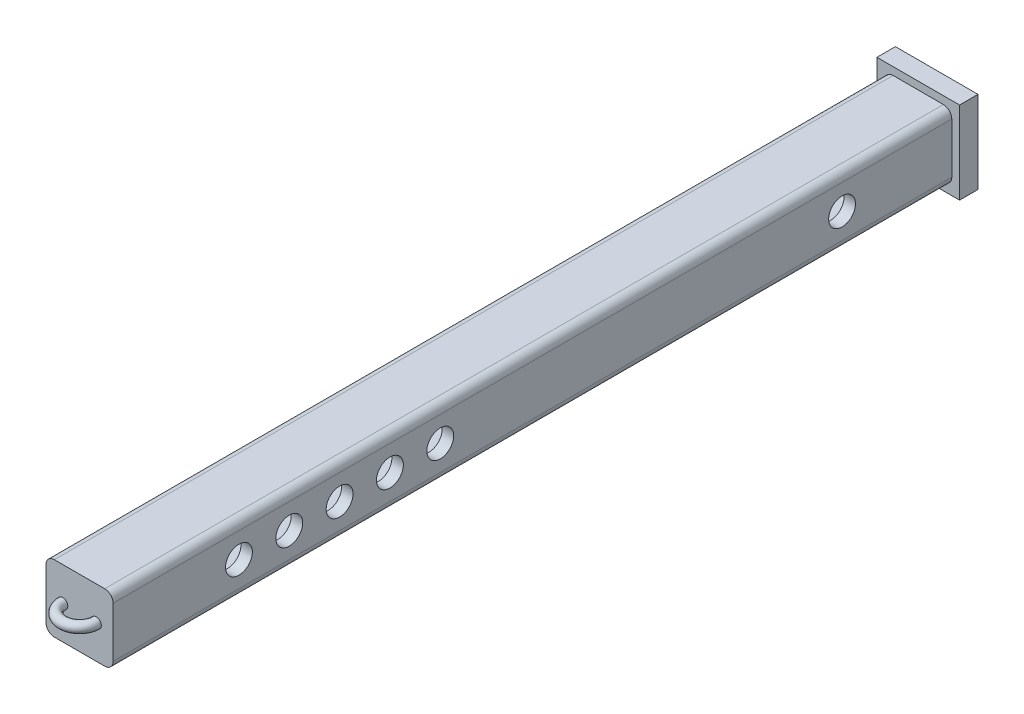
ISO-10303-21;
HEADER;
FILE_DESCRIPTION(('STEP AP214'),'2;1');
FILE_NAME('part.step','',(''),(''),'','','');
FILE_SCHEMA(('AUTOMOTIVE_DESIGN { 1 0 10303 214 1 1 1 1 }'));
ENDSEC;
DATA;
#1=APPLICATION_CONTEXT('core data for automotive mechanical design processes');
#2=APPLICATION_PROTOCOL_DEFINITION('international standard','automotive_design',2000,#1);
#3=PRODUCT_CONTEXT('',#1,'mechanical');
#4=PRODUCT('Part','Part','',(#3));
#5=PRODUCT_RELATED_PRODUCT_CATEGORY('part','',(#4));
#6=PRODUCT_DEFINITION_FORMATION('','',#4);
#7=PRODUCT_DEFINITION_CONTEXT('part definition',#1,'design');
#8=PRODUCT_DEFINITION('design','',#6,#7);
#9=PRODUCT_DEFINITION_SHAPE('','',#8);
#10=(LENGTH_UNIT() NAMED_UNIT(*) SI_UNIT(.MILLI.,.METRE.));
#11=(NAMED_UNIT(*) PLANE_ANGLE_UNIT() SI_UNIT($,.RADIAN.));
#12=(NAMED_UNIT(*) SI_UNIT($,.STERADIAN.) SOLID_ANGLE_UNIT());
#13=UNCERTAINTY_MEASURE_WITH_UNIT(LENGTH_MEASURE(1.E-05),#10,'distance_accuracy_value','');
#14=(GEOMETRIC_REPRESENTATION_CONTEXT(3) GLOBAL_UNCERTAINTY_ASSIGNED_CONTEXT((#13)) GLOBAL_UNIT_ASSIGNED_CONTEXT((#10,
#11,#12)) REPRESENTATION_CONTEXT('',''));
#15=CARTESIAN_POINT('',(0.,0.,0.));
#16=DIRECTION('',(0.,0.,1.));
#17=DIRECTION('',(1.,0.,0.));
#18=AXIS2_PLACEMENT_3D('',#15,#16,#17);
#19=CARTESIAN_POINT('',(20.,-20.,500.));
#20=DIRECTION('',(-1.,0.,0.));
#21=DIRECTION('',(0.,0.,1.));
#22=AXIS2_PLACEMENT_3D('',#19,#20,#21);
#23=PLANE('',#22);
#24=CARTESIAN_POINT('',(20.,0.,65.3991939216552));
#25=DIRECTION('',(1.,0.,0.));
#26=DIRECTION('',(0.,0.,-1.));
#27=AXIS2_PLACEMENT_3D('',#24,#25,#26);
#28=CIRCLE('',#27,8.00000000000001);
#29=CARTESIAN_POINT('',(20.,0.,57.3991939216551));
#30=VERTEX_POINT('',#29);
#31=EDGE_CURVE('E278',#30,#30,#28,.T.);
#32=ORIENTED_EDGE('',*,*,#31,.F.);
#33=EDGE_LOOP('',(#32));
#34=FACE_BOUND('',#33,.T.);
#35=CARTESIAN_POINT('',(20.,-2.09705720765085E-13,334.968679319196));
#36=DIRECTION('',(1.,0.,0.));
#37=DIRECTION('',(0.,0.,-1.));
#38=AXIS2_PLACEMENT_3D('',#35,#36,#37);
#39=CIRCLE('',#38,7.99999999999998);
#40=CARTESIAN_POINT('',(20.,-2.09705720765085E-13,326.968679319196));
#41=VERTEX_POINT('',#40);
#42=EDGE_CURVE('E730',#41,#41,#39,.T.);
#43=ORIENTED_EDGE('',*,*,#42,.F.);
#44=EDGE_LOOP('',(#43));
#45=FACE_BOUND('',#44,.T.);
#46=CARTESIAN_POINT('',(20.,0.,304.968679319196));
#47=DIRECTION('',(1.,0.,0.));
#48=DIRECTION('',(0.,0.,-1.));
#49=AXIS2_PLACEMENT_3D('',#46,#47,#48);
#50=CIRCLE('',#49,7.99999999999998);
#51=CARTESIAN_POINT('',(20.,0.,296.968679319196));
#52=VERTEX_POINT('',#51);
#53=EDGE_CURVE('E727',#52,#52,#50,.T.);
#54=ORIENTED_EDGE('',*,*,#53,.F.);
#55=EDGE_LOOP('',(#54));
#56=FACE_BOUND('',#55,.T.);
#57=CARTESIAN_POINT('',(20.,-4.19194601095673E-13,364.968679319196));
#58=DIRECTION('',(1.,0.,0.));
#59=DIRECTION('',(0.,0.,-1.));
#60=AXIS2_PLACEMENT_3D('',#57,#58,#59);
#61=CIRCLE('',#60,7.99999999999998);
#62=CARTESIAN_POINT('',(20.,-4.19194601095673E-13,356.968679319196));
#63=VERTEX_POINT('',#62);
#64=EDGE_CURVE('E723',#63,#63,#61,.T.);
#65=ORIENTED_EDGE('',*,*,#64,.F.);
#66=EDGE_LOOP('',(#65));
#67=FACE_BOUND('',#66,.T.);
#68=CARTESIAN_POINT('',(20.,-6.28683481426261E-13,394.968679319196));
#69=DIRECTION('',(1.,0.,0.));
#70=DIRECTION('',(0.,0.,-1.));
#71=AXIS2_PLACEMENT_3D('',#68,#69,#70);
#72=CIRCLE('',#71,7.99999999999998);
#73=CARTESIAN_POINT('',(20.,-6.28683481426261E-13,386.968679319196));
#74=VERTEX_POINT('',#73);
#75=EDGE_CURVE('E721',#74,#74,#72,.T.);
#76=ORIENTED_EDGE('',*,*,#75,.F.);
#77=EDGE_LOOP('',(#76));
#78=FACE_BOUND('',#77,.T.);
#79=CARTESIAN_POINT('',(20.,-8.38172361756849E-13,424.968679319196));
#80=DIRECTION('',(1.,0.,0.));
#81=DIRECTION('',(0.,0.,-1.));
#82=AXIS2_PLACEMENT_3D('',#79,#80,#81);
#83=CIRCLE('',#82,7.99999999999998);
#84=CARTESIAN_POINT('',(20.,-8.38172361756849E-13,416.968679319196));
#85=VERTEX_POINT('',#84);
#86=EDGE_CURVE('E717',#85,#85,#83,.T.);
#87=ORIENTED_EDGE('',*,*,#86,.F.);
#88=EDGE_LOOP('',(#87));
#89=FACE_BOUND('',#88,.T.);
#90=DIRECTION('',(0.,1.,0.));
#91=VECTOR('',#90,1.);
#92=CARTESIAN_POINT('',(20.,-20.,500.));
#93=LINE('',#92,#91);
#94=CARTESIAN_POINT('',(20.,-15.,500.));
#95=VERTEX_POINT('',#94);
#96=CARTESIAN_POINT('',(20.,15.,500.));
#97=VERTEX_POINT('',#96);
#98=EDGE_CURVE('E215',#95,#97,#93,.T.);
#99=ORIENTED_EDGE('',*,*,#98,.F.);
#100=DIRECTION('',(0.,0.,-1.));
#101=VECTOR('',#100,1.);
#102=CARTESIAN_POINT('',(20.,-15.,500.));
#103=LINE('',#102,#101);
#104=CARTESIAN_POINT('',(20.,-15.,0.));
#105=VERTEX_POINT('',#104);
#106=EDGE_CURVE('E241',#95,#105,#103,.T.);
#107=ORIENTED_EDGE('',*,*,#106,.T.);
#108=DIRECTION('',(0.,1.,0.));
#109=VECTOR('',#108,1.);
#110=CARTESIAN_POINT('',(20.,-20.,0.));
#111=LINE('',#110,#109);
#112=CARTESIAN_POINT('',(20.,15.,0.));
#113=VERTEX_POINT('',#112);
#114=EDGE_CURVE('E227',#105,#113,#111,.T.);
#115=ORIENTED_EDGE('',*,*,#114,.T.);
#116=DIRECTION('',(0.,0.,-1.));
#117=VECTOR('',#116,1.);
#118=CARTESIAN_POINT('',(20.,15.,500.));
#119=LINE('',#118,#117);
#120=EDGE_CURVE('E226',#113,#97,#119,.F.);
#121=ORIENTED_EDGE('',*,*,#120,.T.);
#122=EDGE_LOOP('',(#99,#107,#115,#121));
#123=FACE_BOUND('',#122,.T.);
#124=ADVANCED_FACE('F33',(#34,#45,#56,#67,#78,#89,#123),#23,.F.);
#125=CARTESIAN_POINT('',(-20.,20.,500.));
#126=DIRECTION('',(0.,-1.,0.));
#127=DIRECTION('',(0.,0.,-1.));
#128=AXIS2_PLACEMENT_3D('',#125,#126,#127);
#129=PLANE('',#128);
#130=DIRECTION('',(-1.,0.,0.));
#131=VECTOR('',#130,1.);
#132=CARTESIAN_POINT('',(-20.,20.,0.));
#133=LINE('',#132,#131);
#134=CARTESIAN_POINT('',(15.,20.,0.));
#135=VERTEX_POINT('',#134);
#136=CARTESIAN_POINT('',(-15.,20.,0.));
#137=VERTEX_POINT('',#136);
#138=EDGE_CURVE('E230',#135,#137,#133,.T.);
#139=ORIENTED_EDGE('',*,*,#138,.T.);
#140=DIRECTION('',(0.,0.,-1.));
#141=VECTOR('',#140,1.);
#142=CARTESIAN_POINT('',(-15.,20.,500.));
#143=LINE('',#142,#141);
#144=CARTESIAN_POINT('',(-15.,20.,500.));
#145=VERTEX_POINT('',#144);
#146=EDGE_CURVE('E11',#137,#145,#143,.F.);
#147=ORIENTED_EDGE('',*,*,#146,.T.);
#148=DIRECTION('',(-1.,0.,0.));
#149=VECTOR('',#148,1.);
#150=CARTESIAN_POINT('',(-20.,20.,500.));
#151=LINE('',#150,#149);
#152=CARTESIAN_POINT('',(15.,20.,500.));
#153=VERTEX_POINT('',#152);
#154=EDGE_CURVE('E218',#153,#145,#151,.T.);
#155=ORIENTED_EDGE('',*,*,#154,.F.);
#156=DIRECTION('',(0.,0.,-1.));
#157=VECTOR('',#156,1.);
#158=CARTESIAN_POINT('',(15.,20.,500.));
#159=LINE('',#158,#157);
#160=EDGE_CURVE('E42',#153,#135,#159,.T.);
#161=ORIENTED_EDGE('',*,*,#160,.T.);
#162=EDGE_LOOP('',(#139,#147,#155,#161));
#163=FACE_BOUND('',#162,.T.);
#164=ADVANCED_FACE('F347',(#163),#129,.F.);
#165=CARTESIAN_POINT('',(-20.,-20.,500.));
#166=DIRECTION('',(1.,0.,0.));
#167=DIRECTION('',(0.,0.,-1.));
#168=AXIS2_PLACEMENT_3D('',#165,#166,#167);
#169=PLANE('',#168);
#170=CARTESIAN_POINT('',(-20.,0.,65.3991939216552));
#171=DIRECTION('',(1.,0.,0.));
#172=DIRECTION('',(0.,0.,-1.));
#173=AXIS2_PLACEMENT_3D('',#170,#171,#172);
#174=CIRCLE('',#173,8.00000000000001);
#175=CARTESIAN_POINT('',(-20.,0.,57.3991939216551));
#176=VERTEX_POINT('',#175);
#177=EDGE_CURVE('E315',#176,#176,#174,.T.);
#178=ORIENTED_EDGE('',*,*,#177,.T.);
#179=EDGE_LOOP('',(#178));
#180=FACE_BOUND('',#179,.T.);
#181=CARTESIAN_POINT('',(-20.,-2.09705720765085E-13,334.968679319196));
#182=DIRECTION('',(1.,0.,0.));
#183=DIRECTION('',(0.,0.,-1.));
#184=AXIS2_PLACEMENT_3D('',#181,#182,#183);
#185=CIRCLE('',#184,7.99999999999998);
#186=CARTESIAN_POINT('',(-20.,-2.09705720765085E-13,326.968679319196));
#187=VERTEX_POINT('',#186);
#188=EDGE_CURVE('E300',#187,#187,#185,.T.);
#189=ORIENTED_EDGE('',*,*,#188,.T.);
#190=EDGE_LOOP('',(#189));
#191=FACE_BOUND('',#190,.T.);
#192=CARTESIAN_POINT('',(-20.,0.,304.968679319196));
#193=DIRECTION('',(1.,0.,0.));
#194=DIRECTION('',(0.,0.,-1.));
#195=AXIS2_PLACEMENT_3D('',#192,#193,#194);
#196=CIRCLE('',#195,7.99999999999998);
#197=CARTESIAN_POINT('',(-20.,0.,296.968679319196));
#198=VERTEX_POINT('',#197);
#199=EDGE_CURVE('E296',#198,#198,#196,.T.);
#200=ORIENTED_EDGE('',*,*,#199,.T.);
#201=EDGE_LOOP('',(#200));
#202=FACE_BOUND('',#201,.T.);
#203=CARTESIAN_POINT('',(-20.,-4.19194601095673E-13,364.968679319196));
#204=DIRECTION('',(1.,0.,0.));
#205=DIRECTION('',(0.,0.,-1.));
#206=AXIS2_PLACEMENT_3D('',#203,#204,#205);
#207=CIRCLE('',#206,7.99999999999998);
#208=CARTESIAN_POINT('',(-20.,-4.19194601095673E-13,356.968679319196));
#209=VERTEX_POINT('',#208);
#210=EDGE_CURVE('E292',#209,#209,#207,.T.);
#211=ORIENTED_EDGE('',*,*,#210,.T.);
#212=EDGE_LOOP('',(#211));
#213=FACE_BOUND('',#212,.T.);
#214=CARTESIAN_POINT('',(-20.,-6.28683481426261E-13,394.968679319196));
#215=DIRECTION('',(1.,0.,0.));
#216=DIRECTION('',(0.,0.,-1.));
#217=AXIS2_PLACEMENT_3D('',#214,#215,#216);
#218=CIRCLE('',#217,7.99999999999998);
#219=CARTESIAN_POINT('',(-20.,-6.28683481426261E-13,386.968679319196));
#220=VERTEX_POINT('',#219);
#221=EDGE_CURVE('E288',#220,#220,#218,.T.);
#222=ORIENTED_EDGE('',*,*,#221,.T.);
#223=EDGE_LOOP('',(#222));
#224=FACE_BOUND('',#223,.T.);
#225=CARTESIAN_POINT('',(-20.,-8.38172361756849E-13,424.968679319196));
#226=DIRECTION('',(1.,0.,0.));
#227=DIRECTION('',(0.,0.,-1.));
#228=AXIS2_PLACEMENT_3D('',#225,#226,#227);
#229=CIRCLE('',#228,7.99999999999998);
#230=CARTESIAN_POINT('',(-20.,-8.38172361756849E-13,416.968679319196));
#231=VERTEX_POINT('',#230);
#232=EDGE_CURVE('E283',#231,#231,#229,.T.);
#233=ORIENTED_EDGE('',*,*,#232,.T.);
#234=EDGE_LOOP('',(#233));
#235=FACE_BOUND('',#234,.T.);
#236=DIRECTION('',(0.,-1.,0.));
#237=VECTOR('',#236,1.);
#238=CARTESIAN_POINT('',(-20.,-20.,0.));
#239=LINE('',#238,#237);
#240=CARTESIAN_POINT('',(-20.,15.,0.));
#241=VERTEX_POINT('',#240);
#242=CARTESIAN_POINT('',(-20.,-15.,0.));
#243=VERTEX_POINT('',#242);
#244=EDGE_CURVE('E233',#241,#243,#239,.T.);
#245=ORIENTED_EDGE('',*,*,#244,.T.);
#246=DIRECTION('',(0.,0.,-1.));
#247=VECTOR('',#246,1.);
#248=CARTESIAN_POINT('',(-20.,-15.,500.));
#249=LINE('',#248,#247);
#250=CARTESIAN_POINT('',(-20.,-15.,500.));
#251=VERTEX_POINT('',#250);
#252=EDGE_CURVE('E50',#243,#251,#249,.F.);
#253=ORIENTED_EDGE('',*,*,#252,.T.);
#254=DIRECTION('',(0.,-1.,0.));
#255=VECTOR('',#254,1.);
#256=CARTESIAN_POINT('',(-20.,-20.,500.));
#257=LINE('',#256,#255);
#258=CARTESIAN_POINT('',(-20.,15.,500.));
#259=VERTEX_POINT('',#258);
#260=EDGE_CURVE('E221',#259,#251,#257,.T.);
#261=ORIENTED_EDGE('',*,*,#260,.F.);
#262=DIRECTION('',(0.,0.,-1.));
#263=VECTOR('',#262,1.);
#264=CARTESIAN_POINT('',(-20.,15.,500.));
#265=LINE('',#264,#263);
#266=EDGE_CURVE('E268',#259,#241,#265,.T.);
#267=ORIENTED_EDGE('',*,*,#266,.T.);
#268=EDGE_LOOP('',(#245,#253,#261,#267));
#269=FACE_BOUND('',#268,.T.);
#270=ADVANCED_FACE('F353',(#180,#191,#202,#213,#224,#235,#269),#169,.F.);
#271=CARTESIAN_POINT('',(-20.,-20.,500.));
#272=DIRECTION('',(0.,1.,0.));
#273=DIRECTION('',(0.,0.,1.));
#274=AXIS2_PLACEMENT_3D('',#271,#272,#273);
#275=PLANE('',#274);
#276=DIRECTION('',(1.,0.,0.));
#277=VECTOR('',#276,1.);
#278=CARTESIAN_POINT('',(-20.,-20.,0.));
#279=LINE('',#278,#277);
#280=CARTESIAN_POINT('',(-15.,-20.,0.));
#281=VERTEX_POINT('',#280);
#282=CARTESIAN_POINT('',(15.,-20.,0.));
#283=VERTEX_POINT('',#282);
#284=EDGE_CURVE('E219',#281,#283,#279,.T.);
#285=ORIENTED_EDGE('',*,*,#284,.T.);
#286=DIRECTION('',(0.,0.,-1.));
#287=VECTOR('',#286,1.);
#288=CARTESIAN_POINT('',(15.,-20.,500.));
#289=LINE('',#288,#287);
#290=CARTESIAN_POINT('',(15.,-20.,500.));
#291=VERTEX_POINT('',#290);
#292=EDGE_CURVE('E259',#283,#291,#289,.F.);
#293=ORIENTED_EDGE('',*,*,#292,.T.);
#294=DIRECTION('',(1.,0.,0.));
#295=VECTOR('',#294,1.);
#296=CARTESIAN_POINT('',(-20.,-20.,500.));
#297=LINE('',#296,#295);
#298=CARTESIAN_POINT('',(-15.,-20.,500.));
#299=VERTEX_POINT('',#298);
#300=EDGE_CURVE('E223',#299,#291,#297,.T.);
#301=ORIENTED_EDGE('',*,*,#300,.F.);
#302=DIRECTION('',(0.,0.,-1.));
#303=VECTOR('',#302,1.);
#304=CARTESIAN_POINT('',(-15.,-20.,500.));
#305=LINE('',#304,#303);
#306=EDGE_CURVE('E256',#299,#281,#305,.T.);
#307=ORIENTED_EDGE('',*,*,#306,.T.);
#308=EDGE_LOOP('',(#285,#293,#301,#307));
#309=FACE_BOUND('',#308,.T.);
#310=ADVANCED_FACE('F385',(#309),#275,.F.);
#311=CARTESIAN_POINT('',(0.,0.,500.));
#312=DIRECTION('',(0.,0.,-1.));
#313=DIRECTION('',(-1.,0.,0.));
#314=AXIS2_PLACEMENT_3D('',#311,#312,#313);
#315=PLANE('',#314);
#316=CARTESIAN_POINT('',(-10.,0.,500.));
#317=DIRECTION('',(0.,0.,-1.));
#318=DIRECTION('',(-1.,0.,0.));
#319=AXIS2_PLACEMENT_3D('',#316,#317,#318);
#320=CIRCLE('',#319,3.);
#321=CARTESIAN_POINT('',(-13.,0.,500.));
#322=VERTEX_POINT('',#321);
#323=EDGE_CURVE('E231',#322,#322,#320,.T.);
#324=ORIENTED_EDGE('',*,*,#323,.T.);
#325=EDGE_LOOP('',(#324));
#326=FACE_BOUND('',#325,.T.);
#327=CARTESIAN_POINT('',(10.,0.,500.));
#328=DIRECTION('',(0.,0.,-1.));
#329=DIRECTION('',(-1.,0.,0.));
#330=AXIS2_PLACEMENT_3D('',#327,#328,#329);
#331=CIRCLE('',#330,3.);
#332=CARTESIAN_POINT('',(13.,0.,500.));
#333=VERTEX_POINT('',#332);
#334=EDGE_CURVE('E206',#333,#333,#331,.T.);
#335=ORIENTED_EDGE('',*,*,#334,.T.);
#336=EDGE_LOOP('',(#335));
#337=FACE_BOUND('',#336,.T.);
#338=ORIENTED_EDGE('',*,*,#300,.T.);
#339=CARTESIAN_POINT('',(15.,-15.,500.));
#340=DIRECTION('',(0.,0.,-1.));
#341=DIRECTION('',(-1.,0.,0.));
#342=AXIS2_PLACEMENT_3D('',#339,#340,#341);
#343=CIRCLE('',#342,5.);
#344=EDGE_CURVE('E266',#291,#95,#343,.F.);
#345=ORIENTED_EDGE('',*,*,#344,.T.);
#346=ORIENTED_EDGE('',*,*,#98,.T.);
#347=CARTESIAN_POINT('',(15.,15.,500.));
#348=DIRECTION('',(0.,0.,-1.));
#349=DIRECTION('',(-1.,0.,0.));
#350=AXIS2_PLACEMENT_3D('',#347,#348,#349);
#351=CIRCLE('',#350,5.);
#352=EDGE_CURVE('E261',#97,#153,#351,.F.);
#353=ORIENTED_EDGE('',*,*,#352,.T.);
#354=ORIENTED_EDGE('',*,*,#154,.T.);
#355=CARTESIAN_POINT('',(-15.,15.,500.));
#356=DIRECTION('',(0.,0.,-1.));
#357=DIRECTION('',(-1.,0.,0.));
#358=AXIS2_PLACEMENT_3D('',#355,#356,#357);
#359=CIRCLE('',#358,5.);
#360=EDGE_CURVE('E57',#145,#259,#359,.F.);
#361=ORIENTED_EDGE('',*,*,#360,.T.);
#362=ORIENTED_EDGE('',*,*,#260,.T.);
#363=CARTESIAN_POINT('',(-15.,-15.,500.));
#364=DIRECTION('',(0.,0.,-1.));
#365=DIRECTION('',(-1.,0.,0.));
#366=AXIS2_PLACEMENT_3D('',#363,#364,#365);
#367=CIRCLE('',#366,5.);
#368=EDGE_CURVE('E264',#251,#299,#367,.F.);
#369=ORIENTED_EDGE('',*,*,#368,.T.);
#370=EDGE_LOOP('',(#338,#345,#346,#353,#354,#361,#362,#369));
#371=FACE_BOUND('',#370,.T.);
#372=ADVANCED_FACE('F388',(#326,#337,#371),#315,.F.);
#373=CARTESIAN_POINT('',(0.,0.,500.));
#374=DIRECTION('',(0.,1.,0.));
#375=DIRECTION('',(0.,0.,1.));
#376=AXIS2_PLACEMENT_3D('',#373,#374,#375);
#377=TOROIDAL_SURFACE('',#376,10.,3.);
#378=CARTESIAN_POINT('',(0.,0.,500.));
#379=DIRECTION('',(0.,1.,0.));
#380=DIRECTION('',(0.,0.,1.));
#381=AXIS2_PLACEMENT_3D('',#378,#379,#380);
#382=CIRCLE('',#381,13.);
#383=EDGE_CURVE('',#322,#333,#382,.T.);
#384=ORIENTED_EDGE('',*,*,#323,.F.);
#385=ORIENTED_EDGE('',*,*,#334,.F.);
#386=ORIENTED_EDGE('',*,*,#383,.T.);
#387=ORIENTED_EDGE('',*,*,#383,.F.);
#388=EDGE_LOOP('',(#384,#386,#385,#387));
#389=FACE_BOUND('',#388,.T.);
#390=ADVANCED_FACE('F364',(#389),#377,.T.);
#391=CARTESIAN_POINT('',(15.,-15.,500.));
#392=DIRECTION('',(0.,0.,-1.));
#393=DIRECTION('',(-1.,0.,0.));
#394=AXIS2_PLACEMENT_3D('',#391,#392,#393);
#395=CYLINDRICAL_SURFACE('',#394,5.);
#396=ORIENTED_EDGE('',*,*,#344,.F.);
#397=ORIENTED_EDGE('',*,*,#292,.F.);
#398=CARTESIAN_POINT('',(15.,-15.,0.));
#399=DIRECTION('',(0.,0.,-1.));
#400=DIRECTION('',(-1.,0.,0.));
#401=AXIS2_PLACEMENT_3D('',#398,#399,#400);
#402=CIRCLE('',#401,5.);
#403=EDGE_CURVE('E253',#105,#283,#402,.T.);
#404=ORIENTED_EDGE('',*,*,#403,.F.);
#405=ORIENTED_EDGE('',*,*,#106,.F.);
#406=EDGE_LOOP('',(#396,#397,#404,#405));
#407=FACE_BOUND('',#406,.T.);
#408=ADVANCED_FACE('F360',(#407),#395,.T.);
#409=CARTESIAN_POINT('',(-15.,-15.,500.));
#410=DIRECTION('',(0.,0.,-1.));
#411=DIRECTION('',(-1.,0.,0.));
#412=AXIS2_PLACEMENT_3D('',#409,#410,#411);
#413=CYLINDRICAL_SURFACE('',#412,5.);
#414=ORIENTED_EDGE('',*,*,#368,.F.);
#415=ORIENTED_EDGE('',*,*,#252,.F.);
#416=CARTESIAN_POINT('',(-15.,-15.,0.));
#417=DIRECTION('',(0.,0.,-1.));
#418=DIRECTION('',(-1.,0.,0.));
#419=AXIS2_PLACEMENT_3D('',#416,#417,#418);
#420=CIRCLE('',#419,5.);
#421=EDGE_CURVE('E250',#281,#243,#420,.T.);
#422=ORIENTED_EDGE('',*,*,#421,.F.);
#423=ORIENTED_EDGE('',*,*,#306,.F.);
#424=EDGE_LOOP('',(#414,#415,#422,#423));
#425=FACE_BOUND('',#424,.T.);
#426=ADVANCED_FACE('F363',(#425),#413,.T.);
#427=CARTESIAN_POINT('',(-15.,15.,500.));
#428=DIRECTION('',(0.,0.,-1.));
#429=DIRECTION('',(-1.,0.,0.));
#430=AXIS2_PLACEMENT_3D('',#427,#428,#429);
#431=CYLINDRICAL_SURFACE('',#430,5.);
#432=ORIENTED_EDGE('',*,*,#360,.F.);
#433=ORIENTED_EDGE('',*,*,#146,.F.);
#434=CARTESIAN_POINT('',(-15.,15.,0.));
#435=DIRECTION('',(0.,0.,-1.));
#436=DIRECTION('',(-1.,0.,0.));
#437=AXIS2_PLACEMENT_3D('',#434,#435,#436);
#438=CIRCLE('',#437,5.);
#439=EDGE_CURVE('E247',#241,#137,#438,.T.);
#440=ORIENTED_EDGE('',*,*,#439,.F.);
#441=ORIENTED_EDGE('',*,*,#266,.F.);
#442=EDGE_LOOP('',(#432,#433,#440,#441));
#443=FACE_BOUND('',#442,.T.);
#444=ADVANCED_FACE('F367',(#443),#431,.T.);
#445=CARTESIAN_POINT('',(15.,15.,500.));
#446=DIRECTION('',(0.,0.,-1.));
#447=DIRECTION('',(-1.,0.,0.));
#448=AXIS2_PLACEMENT_3D('',#445,#446,#447);
#449=CYLINDRICAL_SURFACE('',#448,5.);
#450=ORIENTED_EDGE('',*,*,#352,.F.);
#451=ORIENTED_EDGE('',*,*,#120,.F.);
#452=CARTESIAN_POINT('',(15.,15.,0.));
#453=DIRECTION('',(0.,0.,-1.));
#454=DIRECTION('',(-1.,0.,0.));
#455=AXIS2_PLACEMENT_3D('',#452,#453,#454);
#456=CIRCLE('',#455,5.);
#457=EDGE_CURVE('E244',#135,#113,#456,.T.);
#458=ORIENTED_EDGE('',*,*,#457,.F.);
#459=ORIENTED_EDGE('',*,*,#160,.F.);
#460=EDGE_LOOP('',(#450,#451,#458,#459));
#461=FACE_BOUND('',#460,.T.);
#462=ADVANCED_FACE('F35',(#461),#449,.T.);
#463=CARTESIAN_POINT('',(0.,0.,-11.0000000000001));
#464=DIRECTION('',(0.,0.,-1.));
#465=DIRECTION('',(-1.,0.,0.));
#466=AXIS2_PLACEMENT_3D('',#463,#464,#465);
#467=PLANE('',#466);
#468=DIRECTION('',(0.,-1.,0.));
#469=VECTOR('',#468,1.);
#470=CARTESIAN_POINT('',(24.6272492974261,-24.5712782790133,-11.0000000000001));
#471=LINE('',#470,#469);
#472=CARTESIAN_POINT('',(24.6272492974261,24.5712782790133,-11.0000000000001));
#473=VERTEX_POINT('',#472);
#474=CARTESIAN_POINT('',(24.6272492974261,-24.5712782790133,-11.0000000000001));
#475=VERTEX_POINT('',#474);
#476=EDGE_CURVE('E159',#473,#475,#471,.T.);
#477=ORIENTED_EDGE('',*,*,#476,.T.);
#478=DIRECTION('',(-1.,0.,0.));
#479=VECTOR('',#478,1.);
#480=CARTESIAN_POINT('',(-24.6272492974261,-24.5712782790133,-11.0000000000001));
#481=LINE('',#480,#479);
#482=CARTESIAN_POINT('',(-24.6272492974261,-24.5712782790133,-11.0000000000001));
#483=VERTEX_POINT('',#482);
#484=EDGE_CURVE('E148',#475,#483,#481,.T.);
#485=ORIENTED_EDGE('',*,*,#484,.T.);
#486=DIRECTION('',(0.,1.,0.));
#487=VECTOR('',#486,1.);
#488=CARTESIAN_POINT('',(-24.6272492974261,-24.5712782790133,-11.0000000000001));
#489=LINE('',#488,#487);
#490=CARTESIAN_POINT('',(-24.6272492974261,24.5712782790133,-11.0000000000001));
#491=VERTEX_POINT('',#490);
#492=EDGE_CURVE('E158',#483,#491,#489,.T.);
#493=ORIENTED_EDGE('',*,*,#492,.T.);
#494=DIRECTION('',(1.,0.,0.));
#495=VECTOR('',#494,1.);
#496=CARTESIAN_POINT('',(-24.6272492974261,24.5712782790133,-11.0000000000001));
#497=LINE('',#496,#495);
#498=EDGE_CURVE('E164',#491,#473,#497,.T.);
#499=ORIENTED_EDGE('',*,*,#498,.T.);
#500=EDGE_LOOP('',(#477,#485,#493,#499));
#501=FACE_BOUND('',#500,.T.);
#502=ADVANCED_FACE('F162',(#501),#467,.T.);
#503=CARTESIAN_POINT('',(-24.6272492974261,24.5712782790133,-11.0000000000001));
#504=DIRECTION('',(0.,-1.,0.));
#505=DIRECTION('',(0.,0.,-1.));
#506=AXIS2_PLACEMENT_3D('',#503,#504,#505);
#507=PLANE('',#506);
#508=DIRECTION('',(1.,0.,0.));
#509=VECTOR('',#508,1.);
#510=CARTESIAN_POINT('',(-24.6272492974261,24.5712782790133,0.));
#511=LINE('',#510,#509);
#512=CARTESIAN_POINT('',(-24.6272492974261,24.5712782790133,0.));
#513=VERTEX_POINT('',#512);
#514=CARTESIAN_POINT('',(24.6272492974261,24.5712782790133,0.));
#515=VERTEX_POINT('',#514);
#516=EDGE_CURVE('E168',#513,#515,#511,.T.);
#517=ORIENTED_EDGE('',*,*,#516,.T.);
#518=DIRECTION('',(0.,0.,1.));
#519=VECTOR('',#518,1.);
#520=CARTESIAN_POINT('',(24.6272492974261,24.5712782790133,-11.0000000000001));
#521=LINE('',#520,#519);
#522=EDGE_CURVE('E320',#473,#515,#521,.T.);
#523=ORIENTED_EDGE('',*,*,#522,.F.);
#524=ORIENTED_EDGE('',*,*,#498,.F.);
#525=DIRECTION('',(0.,0.,1.));
#526=VECTOR('',#525,1.);
#527=CARTESIAN_POINT('',(-24.6272492974261,24.5712782790133,-11.0000000000001));
#528=LINE('',#527,#526);
#529=EDGE_CURVE('E178',#491,#513,#528,.T.);
#530=ORIENTED_EDGE('',*,*,#529,.T.);
#531=EDGE_LOOP('',(#517,#523,#524,#530));
#532=FACE_BOUND('',#531,.T.);
#533=ADVANCED_FACE('F331',(#532),#507,.F.);
#534=CARTESIAN_POINT('',(-24.6272492974261,-24.5712782790133,-11.0000000000001));
#535=DIRECTION('',(1.,0.,0.));
#536=DIRECTION('',(0.,0.,-1.));
#537=AXIS2_PLACEMENT_3D('',#534,#535,#536);
#538=PLANE('',#537);
#539=DIRECTION('',(0.,1.,0.));
#540=VECTOR('',#539,1.);
#541=CARTESIAN_POINT('',(-24.6272492974261,-24.5712782790133,0.));
#542=LINE('',#541,#540);
#543=CARTESIAN_POINT('',(-24.6272492974261,-24.5712782790133,0.));
#544=VERTEX_POINT('',#543);
#545=EDGE_CURVE('E324',#544,#513,#542,.T.);
#546=ORIENTED_EDGE('',*,*,#545,.T.);
#547=ORIENTED_EDGE('',*,*,#529,.F.);
#548=ORIENTED_EDGE('',*,*,#492,.F.);
#549=DIRECTION('',(0.,0.,1.));
#550=VECTOR('',#549,1.);
#551=CARTESIAN_POINT('',(-24.6272492974261,-24.5712782790133,-11.0000000000001));
#552=LINE('',#551,#550);
#553=EDGE_CURVE('E155',#483,#544,#552,.T.);
#554=ORIENTED_EDGE('',*,*,#553,.T.);
#555=EDGE_LOOP('',(#546,#547,#548,#554));
#556=FACE_BOUND('',#555,.T.);
#557=ADVANCED_FACE('F337',(#556),#538,.F.);
#558=CARTESIAN_POINT('',(-24.6272492974261,-24.5712782790133,-11.0000000000001));
#559=DIRECTION('',(0.,1.,0.));
#560=DIRECTION('',(0.,0.,1.));
#561=AXIS2_PLACEMENT_3D('',#558,#559,#560);
#562=PLANE('',#561);
#563=DIRECTION('',(-1.,0.,0.));
#564=VECTOR('',#563,1.);
#565=CARTESIAN_POINT('',(-24.6272492974261,-24.5712782790133,0.));
#566=LINE('',#565,#564);
#567=CARTESIAN_POINT('',(24.6272492974261,-24.5712782790133,0.));
#568=VERTEX_POINT('',#567);
#569=EDGE_CURVE('E322',#568,#544,#566,.T.);
#570=ORIENTED_EDGE('',*,*,#569,.T.);
#571=ORIENTED_EDGE('',*,*,#553,.F.);
#572=ORIENTED_EDGE('',*,*,#484,.F.);
#573=DIRECTION('',(0.,0.,1.));
#574=VECTOR('',#573,1.);
#575=CARTESIAN_POINT('',(24.6272492974261,-24.5712782790133,-11.0000000000001));
#576=LINE('',#575,#574);
#577=EDGE_CURVE('E152',#475,#568,#576,.T.);
#578=ORIENTED_EDGE('',*,*,#577,.T.);
#579=EDGE_LOOP('',(#570,#571,#572,#578));
#580=FACE_BOUND('',#579,.T.);
#581=ADVANCED_FACE('F150',(#580),#562,.F.);
#582=CARTESIAN_POINT('',(24.6272492974261,-24.5712782790133,-11.0000000000001));
#583=DIRECTION('',(-1.,0.,0.));
#584=DIRECTION('',(0.,0.,1.));
#585=AXIS2_PLACEMENT_3D('',#582,#583,#584);
#586=PLANE('',#585);
#587=DIRECTION('',(0.,-1.,0.));
#588=VECTOR('',#587,1.);
#589=CARTESIAN_POINT('',(24.6272492974261,-24.5712782790133,0.));
#590=LINE('',#589,#588);
#591=EDGE_CURVE('E172',#515,#568,#590,.T.);
#592=ORIENTED_EDGE('',*,*,#591,.T.);
#593=ORIENTED_EDGE('',*,*,#577,.F.);
#594=ORIENTED_EDGE('',*,*,#476,.F.);
#595=ORIENTED_EDGE('',*,*,#522,.T.);
#596=EDGE_LOOP('',(#592,#593,#594,#595));
#597=FACE_BOUND('',#596,.T.);
#598=ADVANCED_FACE('F170',(#597),#586,.F.);
#599=CARTESIAN_POINT('',(0.,0.,0.));
#600=DIRECTION('',(0.,0.,-1.));
#601=DIRECTION('',(-1.,0.,0.));
#602=AXIS2_PLACEMENT_3D('',#599,#600,#601);
#603=PLANE('',#602);
#604=ORIENTED_EDGE('',*,*,#591,.F.);
#605=ORIENTED_EDGE('',*,*,#516,.F.);
#606=ORIENTED_EDGE('',*,*,#545,.F.);
#607=ORIENTED_EDGE('',*,*,#569,.F.);
#608=EDGE_LOOP('',(#604,#605,#606,#607));
#609=FACE_BOUND('',#608,.T.);
#610=ORIENTED_EDGE('',*,*,#114,.F.);
#611=ORIENTED_EDGE('',*,*,#403,.T.);
#612=ORIENTED_EDGE('',*,*,#284,.F.);
#613=ORIENTED_EDGE('',*,*,#421,.T.);
#614=ORIENTED_EDGE('',*,*,#244,.F.);
#615=ORIENTED_EDGE('',*,*,#439,.T.);
#616=ORIENTED_EDGE('',*,*,#138,.F.);
#617=ORIENTED_EDGE('',*,*,#457,.T.);
#618=EDGE_LOOP('',(#610,#611,#612,#613,#614,#615,#616,#617));
#619=FACE_BOUND('',#618,.T.);
#620=ADVANCED_FACE('F335',(#609,#619),#603,.F.);
#621=CARTESIAN_POINT('',(-129.,-8.38172361756849E-13,424.968679319196));
#622=DIRECTION('',(1.,0.,0.));
#623=DIRECTION('',(0.,0.,-1.));
#624=AXIS2_PLACEMENT_3D('',#621,#622,#623);
#625=CYLINDRICAL_SURFACE('',#624,7.99999999999998);
#626=CARTESIAN_POINT('',(-13.1597277355186,-8.38172361756849E-13,424.968679319196));
#627=DIRECTION('',(-1.,0.,0.));
#628=DIRECTION('',(0.,0.,1.));
#629=AXIS2_PLACEMENT_3D('',#626,#627,#628);
#630=CIRCLE('',#629,7.99999999999998);
#631=CARTESIAN_POINT('',(-13.1597277355186,-8.38172361756849E-13,432.968679319196));
#632=VERTEX_POINT('',#631);
#633=EDGE_CURVE('E274',#632,#632,#630,.T.);
#634=ORIENTED_EDGE('',*,*,#633,.F.);
#635=EDGE_LOOP('',(#634));
#636=FACE_BOUND('',#635,.T.);
#637=ORIENTED_EDGE('',*,*,#232,.F.);
#638=EDGE_LOOP('',(#637));
#639=FACE_BOUND('',#638,.T.);
#640=ADVANCED_FACE('F466',(#636,#639),#625,.F.);
#641=CARTESIAN_POINT('',(-129.,-6.28683481426261E-13,394.968679319196));
#642=DIRECTION('',(1.,0.,0.));
#643=DIRECTION('',(0.,0.,-1.));
#644=AXIS2_PLACEMENT_3D('',#641,#642,#643);
#645=CYLINDRICAL_SURFACE('',#644,7.99999999999998);
#646=CARTESIAN_POINT('',(-13.1597277355186,-6.28683481426261E-13,394.968679319196));
#647=DIRECTION('',(-1.,0.,0.));
#648=DIRECTION('',(0.,0.,1.));
#649=AXIS2_PLACEMENT_3D('',#646,#647,#648);
#650=CIRCLE('',#649,7.99999999999998);
#651=CARTESIAN_POINT('',(-13.1597277355186,-6.28683481426261E-13,402.968679319196));
#652=VERTEX_POINT('',#651);
#653=EDGE_CURVE('E279',#652,#652,#650,.T.);
#654=ORIENTED_EDGE('',*,*,#653,.F.);
#655=EDGE_LOOP('',(#654));
#656=FACE_BOUND('',#655,.T.);
#657=ORIENTED_EDGE('',*,*,#221,.F.);
#658=EDGE_LOOP('',(#657));
#659=FACE_BOUND('',#658,.T.);
#660=ADVANCED_FACE('F456',(#656,#659),#645,.F.);
#661=CARTESIAN_POINT('',(-129.,-4.19194601095673E-13,364.968679319196));
#662=DIRECTION('',(1.,0.,0.));
#663=DIRECTION('',(0.,0.,-1.));
#664=AXIS2_PLACEMENT_3D('',#661,#662,#663);
#665=CYLINDRICAL_SURFACE('',#664,7.99999999999998);
#666=CARTESIAN_POINT('',(-13.1597277355186,-4.19194601095673E-13,364.968679319196));
#667=DIRECTION('',(-1.,0.,0.));
#668=DIRECTION('',(0.,0.,1.));
#669=AXIS2_PLACEMENT_3D('',#666,#667,#668);
#670=CIRCLE('',#669,7.99999999999998);
#671=CARTESIAN_POINT('',(-13.1597277355186,-4.19194601095673E-13,372.968679319196));
#672=VERTEX_POINT('',#671);
#673=EDGE_CURVE('E284',#672,#672,#670,.T.);
#674=ORIENTED_EDGE('',*,*,#673,.F.);
#675=EDGE_LOOP('',(#674));
#676=FACE_BOUND('',#675,.T.);
#677=ORIENTED_EDGE('',*,*,#210,.F.);
#678=EDGE_LOOP('',(#677));
#679=FACE_BOUND('',#678,.T.);
#680=ADVANCED_FACE('F444',(#676,#679),#665,.F.);
#681=CARTESIAN_POINT('',(-129.,0.,304.968679319196));
#682=DIRECTION('',(1.,0.,0.));
#683=DIRECTION('',(0.,0.,-1.));
#684=AXIS2_PLACEMENT_3D('',#681,#682,#683);
#685=CYLINDRICAL_SURFACE('',#684,7.99999999999998);
#686=CARTESIAN_POINT('',(-13.1597277355186,0.,304.968679319196));
#687=DIRECTION('',(-1.,0.,0.));
#688=DIRECTION('',(0.,0.,1.));
#689=AXIS2_PLACEMENT_3D('',#686,#687,#688);
#690=CIRCLE('',#689,7.99999999999998);
#691=CARTESIAN_POINT('',(-13.1597277355186,0.,312.968679319196));
#692=VERTEX_POINT('',#691);
#693=EDGE_CURVE('E289',#692,#692,#690,.T.);
#694=ORIENTED_EDGE('',*,*,#693,.F.);
#695=EDGE_LOOP('',(#694));
#696=FACE_BOUND('',#695,.T.);
#697=ORIENTED_EDGE('',*,*,#199,.F.);
#698=EDGE_LOOP('',(#697));
#699=FACE_BOUND('',#698,.T.);
#700=ADVANCED_FACE('F452',(#696,#699),#685,.F.);
#701=CARTESIAN_POINT('',(-129.,-2.09705720765085E-13,334.968679319196));
#702=DIRECTION('',(1.,0.,0.));
#703=DIRECTION('',(0.,0.,-1.));
#704=AXIS2_PLACEMENT_3D('',#701,#702,#703);
#705=CYLINDRICAL_SURFACE('',#704,7.99999999999998);
#706=CARTESIAN_POINT('',(-13.1597277355186,-2.09705720765085E-13,334.968679319196));
#707=DIRECTION('',(-1.,0.,0.));
#708=DIRECTION('',(0.,0.,1.));
#709=AXIS2_PLACEMENT_3D('',#706,#707,#708);
#710=CIRCLE('',#709,7.99999999999998);
#711=CARTESIAN_POINT('',(-13.1597277355186,-2.09705720765085E-13,342.968679319196));
#712=VERTEX_POINT('',#711);
#713=EDGE_CURVE('E293',#712,#712,#710,.T.);
#714=ORIENTED_EDGE('',*,*,#713,.F.);
#715=EDGE_LOOP('',(#714));
#716=FACE_BOUND('',#715,.T.);
#717=ORIENTED_EDGE('',*,*,#188,.F.);
#718=EDGE_LOOP('',(#717));
#719=FACE_BOUND('',#718,.T.);
#720=ADVANCED_FACE('F464',(#716,#719),#705,.F.);
#721=CARTESIAN_POINT('',(-129.,0.,65.3991939216552));
#722=DIRECTION('',(1.,0.,0.));
#723=DIRECTION('',(0.,0.,-1.));
#724=AXIS2_PLACEMENT_3D('',#721,#722,#723);
#725=CYLINDRICAL_SURFACE('',#724,8.00000000000001);
#726=CARTESIAN_POINT('',(-13.1597277355186,0.,65.3991939216552));
#727=DIRECTION('',(-1.,0.,0.));
#728=DIRECTION('',(0.,0.,1.));
#729=AXIS2_PLACEMENT_3D('',#726,#727,#728);
#730=CIRCLE('',#729,8.00000000000001);
#731=CARTESIAN_POINT('',(-13.1597277355186,0.,73.3991939216552));
#732=VERTEX_POINT('',#731);
#733=EDGE_CURVE('E37',#732,#732,#730,.T.);
#734=ORIENTED_EDGE('',*,*,#733,.F.);
#735=EDGE_LOOP('',(#734));
#736=FACE_BOUND('',#735,.T.);
#737=ORIENTED_EDGE('',*,*,#177,.F.);
#738=EDGE_LOOP('',(#737));
#739=FACE_BOUND('',#738,.T.);
#740=ADVANCED_FACE('F628',(#736,#739),#725,.F.);
#741=ORIENTED_EDGE('',*,*,#86,.T.);
#742=EDGE_LOOP('',(#741));
#743=FACE_BOUND('',#742,.T.);
#744=CARTESIAN_POINT('',(13.1597277355186,-8.38172361756849E-13,424.968679319196));
#745=DIRECTION('',(1.,0.,0.));
#746=DIRECTION('',(0.,0.,-1.));
#747=AXIS2_PLACEMENT_3D('',#744,#745,#746);
#748=CIRCLE('',#747,7.99999999999998);
#749=CARTESIAN_POINT('',(13.1597277355186,-8.38172361756849E-13,416.968679319196));
#750=VERTEX_POINT('',#749);
#751=EDGE_CURVE('E277',#750,#750,#748,.T.);
#752=ORIENTED_EDGE('',*,*,#751,.F.);
#753=EDGE_LOOP('',(#752));
#754=FACE_BOUND('',#753,.T.);
#755=ADVANCED_FACE('F453',(#743,#754),#625,.F.);
#756=ORIENTED_EDGE('',*,*,#75,.T.);
#757=EDGE_LOOP('',(#756));
#758=FACE_BOUND('',#757,.T.);
#759=CARTESIAN_POINT('',(13.1597277355186,-6.28683481426261E-13,394.968679319196));
#760=DIRECTION('',(1.,0.,0.));
#761=DIRECTION('',(0.,0.,-1.));
#762=AXIS2_PLACEMENT_3D('',#759,#760,#761);
#763=CIRCLE('',#762,7.99999999999998);
#764=CARTESIAN_POINT('',(13.1597277355186,-6.28683481426261E-13,386.968679319196));
#765=VERTEX_POINT('',#764);
#766=EDGE_CURVE('E282',#765,#765,#763,.T.);
#767=ORIENTED_EDGE('',*,*,#766,.F.);
#768=EDGE_LOOP('',(#767));
#769=FACE_BOUND('',#768,.T.);
#770=ADVANCED_FACE('F441',(#758,#769),#645,.F.);
#771=ORIENTED_EDGE('',*,*,#64,.T.);
#772=EDGE_LOOP('',(#771));
#773=FACE_BOUND('',#772,.T.);
#774=CARTESIAN_POINT('',(13.1597277355186,-4.19194601095673E-13,364.968679319196));
#775=DIRECTION('',(1.,0.,0.));
#776=DIRECTION('',(0.,0.,-1.));
#777=AXIS2_PLACEMENT_3D('',#774,#775,#776);
#778=CIRCLE('',#777,7.99999999999998);
#779=CARTESIAN_POINT('',(13.1597277355186,-4.19194601095673E-13,356.968679319196));
#780=VERTEX_POINT('',#779);
#781=EDGE_CURVE('E287',#780,#780,#778,.T.);
#782=ORIENTED_EDGE('',*,*,#781,.F.);
#783=EDGE_LOOP('',(#782));
#784=FACE_BOUND('',#783,.T.);
#785=ADVANCED_FACE('F438',(#773,#784),#665,.F.);
#786=ORIENTED_EDGE('',*,*,#53,.T.);
#787=EDGE_LOOP('',(#786));
#788=FACE_BOUND('',#787,.T.);
#789=CARTESIAN_POINT('',(13.1597277355186,0.,304.968679319196));
#790=DIRECTION('',(1.,0.,0.));
#791=DIRECTION('',(0.,0.,-1.));
#792=AXIS2_PLACEMENT_3D('',#789,#790,#791);
#793=CIRCLE('',#792,7.99999999999998);
#794=CARTESIAN_POINT('',(13.1597277355186,0.,296.968679319196));
#795=VERTEX_POINT('',#794);
#796=EDGE_CURVE('E291',#795,#795,#793,.T.);
#797=ORIENTED_EDGE('',*,*,#796,.F.);
#798=EDGE_LOOP('',(#797));
#799=FACE_BOUND('',#798,.T.);
#800=ADVANCED_FACE('F440',(#788,#799),#685,.F.);
#801=ORIENTED_EDGE('',*,*,#42,.T.);
#802=EDGE_LOOP('',(#801));
#803=FACE_BOUND('',#802,.T.);
#804=CARTESIAN_POINT('',(13.1597277355186,-2.09705720765085E-13,334.968679319196));
#805=DIRECTION('',(1.,0.,0.));
#806=DIRECTION('',(0.,0.,-1.));
#807=AXIS2_PLACEMENT_3D('',#804,#805,#806);
#808=CIRCLE('',#807,7.99999999999998);
#809=CARTESIAN_POINT('',(13.1597277355186,-2.09705720765085E-13,326.968679319196));
#810=VERTEX_POINT('',#809);
#811=EDGE_CURVE('E295',#810,#810,#808,.T.);
#812=ORIENTED_EDGE('',*,*,#811,.F.);
#813=EDGE_LOOP('',(#812));
#814=FACE_BOUND('',#813,.T.);
#815=ADVANCED_FACE('F449',(#803,#814),#705,.F.);
#816=ORIENTED_EDGE('',*,*,#31,.T.);
#817=EDGE_LOOP('',(#816));
#818=FACE_BOUND('',#817,.T.);
#819=CARTESIAN_POINT('',(13.1597277355186,0.,65.3991939216552));
#820=DIRECTION('',(1.,0.,0.));
#821=DIRECTION('',(0.,0.,-1.));
#822=AXIS2_PLACEMENT_3D('',#819,#820,#821);
#823=CIRCLE('',#822,8.00000000000001);
#824=CARTESIAN_POINT('',(13.1597277355186,0.,57.3991939216551));
#825=VERTEX_POINT('',#824);
#826=EDGE_CURVE('E312',#825,#825,#823,.T.);
#827=ORIENTED_EDGE('',*,*,#826,.F.);
#828=EDGE_LOOP('',(#827));
#829=FACE_BOUND('',#828,.T.);
#830=ADVANCED_FACE('F505',(#818,#829),#725,.F.);
#831=CARTESIAN_POINT('',(0.,0.,484.));
#832=DIRECTION('',(0.,0.,1.));
#833=DIRECTION('',(1.,0.,0.));
#834=AXIS2_PLACEMENT_3D('',#831,#832,#833);
#835=PLANE('',#834);
#836=DIRECTION('',(0.,1.,0.));
#837=VECTOR('',#836,1.);
#838=CARTESIAN_POINT('',(-13.1597277355186,-13.5183034231367,484.));
#839=LINE('',#838,#837);
#840=CARTESIAN_POINT('',(-13.1597277355186,-13.5183034231367,484.));
#841=VERTEX_POINT('',#840);
#842=CARTESIAN_POINT('',(-13.1597277355186,13.5183034231367,484.));
#843=VERTEX_POINT('',#842);
#844=EDGE_CURVE('E182',#841,#843,#839,.T.);
#845=ORIENTED_EDGE('',*,*,#844,.T.);
#846=DIRECTION('',(1.,0.,0.));
#847=VECTOR('',#846,1.);
#848=CARTESIAN_POINT('',(13.1597277355186,13.5183034231367,484.));
#849=LINE('',#848,#847);
#850=CARTESIAN_POINT('',(13.1597277355186,13.5183034231367,484.));
#851=VERTEX_POINT('',#850);
#852=EDGE_CURVE('E185',#843,#851,#849,.T.);
#853=ORIENTED_EDGE('',*,*,#852,.T.);
#854=DIRECTION('',(0.,-1.,0.));
#855=VECTOR('',#854,1.);
#856=CARTESIAN_POINT('',(13.1597277355186,-13.5183034231367,484.));
#857=LINE('',#856,#855);
#858=CARTESIAN_POINT('',(13.1597277355186,-13.5183034231367,484.));
#859=VERTEX_POINT('',#858);
#860=EDGE_CURVE('E189',#851,#859,#857,.T.);
#861=ORIENTED_EDGE('',*,*,#860,.T.);
#862=DIRECTION('',(-1.,0.,0.));
#863=VECTOR('',#862,1.);
#864=CARTESIAN_POINT('',(13.1597277355186,-13.5183034231367,484.));
#865=LINE('',#864,#863);
#866=EDGE_CURVE('E192',#859,#841,#865,.T.);
#867=ORIENTED_EDGE('',*,*,#866,.T.);
#868=EDGE_LOOP('',(#845,#853,#861,#867));
#869=FACE_BOUND('',#868,.T.);
#870=ADVANCED_FACE('F488',(#869),#835,.F.);
#871=CARTESIAN_POINT('',(13.1597277355186,13.5183034231367,484.));
#872=DIRECTION('',(0.,1.,0.));
#873=DIRECTION('',(0.,0.,1.));
#874=AXIS2_PLACEMENT_3D('',#871,#872,#873);
#875=PLANE('',#874);
#876=DIRECTION('',(1.,0.,0.));
#877=VECTOR('',#876,1.);
#878=CARTESIAN_POINT('',(13.1597277355186,13.5183034231367,0.));
#879=LINE('',#878,#877);
#880=CARTESIAN_POINT('',(-13.1597277355186,13.5183034231367,0.));
#881=VERTEX_POINT('',#880);
#882=CARTESIAN_POINT('',(13.1597277355186,13.5183034231367,0.));
#883=VERTEX_POINT('',#882);
#884=EDGE_CURVE('E176',#881,#883,#879,.T.);
#885=ORIENTED_EDGE('',*,*,#884,.T.);
#886=DIRECTION('',(0.,0.,-1.));
#887=VECTOR('',#886,1.);
#888=CARTESIAN_POINT('',(13.1597277355186,13.5183034231367,484.));
#889=LINE('',#888,#887);
#890=EDGE_CURVE('E210',#851,#883,#889,.T.);
#891=ORIENTED_EDGE('',*,*,#890,.F.);
#892=ORIENTED_EDGE('',*,*,#852,.F.);
#893=DIRECTION('',(0.,0.,-1.));
#894=VECTOR('',#893,1.);
#895=CARTESIAN_POINT('',(-13.1597277355186,13.5183034231367,484.));
#896=LINE('',#895,#894);
#897=EDGE_CURVE('E194',#843,#881,#896,.T.);
#898=ORIENTED_EDGE('',*,*,#897,.T.);
#899=EDGE_LOOP('',(#885,#891,#892,#898));
#900=FACE_BOUND('',#899,.T.);
#901=ADVANCED_FACE('F485',(#900),#875,.F.);
#902=CARTESIAN_POINT('',(13.1597277355186,-13.5183034231367,484.));
#903=DIRECTION('',(1.,0.,0.));
#904=DIRECTION('',(0.,0.,-1.));
#905=AXIS2_PLACEMENT_3D('',#902,#903,#904);
#906=PLANE('',#905);
#907=ORIENTED_EDGE('',*,*,#826,.T.);
#908=EDGE_LOOP('',(#907));
#909=FACE_BOUND('',#908,.T.);
#910=ORIENTED_EDGE('',*,*,#811,.T.);
#911=EDGE_LOOP('',(#910));
#912=FACE_BOUND('',#911,.T.);
#913=ORIENTED_EDGE('',*,*,#796,.T.);
#914=EDGE_LOOP('',(#913));
#915=FACE_BOUND('',#914,.T.);
#916=ORIENTED_EDGE('',*,*,#781,.T.);
#917=EDGE_LOOP('',(#916));
#918=FACE_BOUND('',#917,.T.);
#919=ORIENTED_EDGE('',*,*,#766,.T.);
#920=EDGE_LOOP('',(#919));
#921=FACE_BOUND('',#920,.T.);
#922=ORIENTED_EDGE('',*,*,#751,.T.);
#923=EDGE_LOOP('',(#922));
#924=FACE_BOUND('',#923,.T.);
#925=DIRECTION('',(0.,-1.,0.));
#926=VECTOR('',#925,1.);
#927=CARTESIAN_POINT('',(13.1597277355186,-13.5183034231367,0.));
#928=LINE('',#927,#926);
#929=CARTESIAN_POINT('',(13.1597277355186,-13.5183034231367,0.));
#930=VERTEX_POINT('',#929);
#931=EDGE_CURVE('E198',#883,#930,#928,.T.);
#932=ORIENTED_EDGE('',*,*,#931,.T.);
#933=DIRECTION('',(0.,0.,-1.));
#934=VECTOR('',#933,1.);
#935=CARTESIAN_POINT('',(13.1597277355186,-13.5183034231367,484.));
#936=LINE('',#935,#934);
#937=EDGE_CURVE('E207',#859,#930,#936,.T.);
#938=ORIENTED_EDGE('',*,*,#937,.F.);
#939=ORIENTED_EDGE('',*,*,#860,.F.);
#940=ORIENTED_EDGE('',*,*,#890,.T.);
#941=EDGE_LOOP('',(#932,#938,#939,#940));
#942=FACE_BOUND('',#941,.T.);
#943=ADVANCED_FACE('F435',(#909,#912,#915,#918,#921,#924,#942),#906,.F.);
#944=CARTESIAN_POINT('',(13.1597277355186,-13.5183034231367,484.));
#945=DIRECTION('',(0.,-1.,0.));
#946=DIRECTION('',(0.,0.,-1.));
#947=AXIS2_PLACEMENT_3D('',#944,#945,#946);
#948=PLANE('',#947);
#949=DIRECTION('',(-1.,0.,0.));
#950=VECTOR('',#949,1.);
#951=CARTESIAN_POINT('',(13.1597277355186,-13.5183034231367,0.));
#952=LINE('',#951,#950);
#953=CARTESIAN_POINT('',(-13.1597277355186,-13.5183034231367,0.));
#954=VERTEX_POINT('',#953);
#955=EDGE_CURVE('E186',#930,#954,#952,.T.);
#956=ORIENTED_EDGE('',*,*,#955,.T.);
#957=DIRECTION('',(0.,0.,-1.));
#958=VECTOR('',#957,1.);
#959=CARTESIAN_POINT('',(-13.1597277355186,-13.5183034231367,484.));
#960=LINE('',#959,#958);
#961=EDGE_CURVE('E203',#841,#954,#960,.T.);
#962=ORIENTED_EDGE('',*,*,#961,.F.);
#963=ORIENTED_EDGE('',*,*,#866,.F.);
#964=ORIENTED_EDGE('',*,*,#937,.T.);
#965=EDGE_LOOP('',(#956,#962,#963,#964));
#966=FACE_BOUND('',#965,.T.);
#967=ADVANCED_FACE('F475',(#966),#948,.F.);
#968=CARTESIAN_POINT('',(-13.1597277355186,-13.5183034231367,484.));
#969=DIRECTION('',(-1.,0.,0.));
#970=DIRECTION('',(0.,0.,1.));
#971=AXIS2_PLACEMENT_3D('',#968,#969,#970);
#972=PLANE('',#971);
#973=ORIENTED_EDGE('',*,*,#733,.T.);
#974=EDGE_LOOP('',(#973));
#975=FACE_BOUND('',#974,.T.);
#976=ORIENTED_EDGE('',*,*,#713,.T.);
#977=EDGE_LOOP('',(#976));
#978=FACE_BOUND('',#977,.T.);
#979=ORIENTED_EDGE('',*,*,#693,.T.);
#980=EDGE_LOOP('',(#979));
#981=FACE_BOUND('',#980,.T.);
#982=ORIENTED_EDGE('',*,*,#673,.T.);
#983=EDGE_LOOP('',(#982));
#984=FACE_BOUND('',#983,.T.);
#985=ORIENTED_EDGE('',*,*,#653,.T.);
#986=EDGE_LOOP('',(#985));
#987=FACE_BOUND('',#986,.T.);
#988=ORIENTED_EDGE('',*,*,#633,.T.);
#989=EDGE_LOOP('',(#988));
#990=FACE_BOUND('',#989,.T.);
#991=DIRECTION('',(0.,1.,0.));
#992=VECTOR('',#991,1.);
#993=CARTESIAN_POINT('',(-13.1597277355186,-13.5183034231367,0.));
#994=LINE('',#993,#992);
#995=EDGE_CURVE('E173',#954,#881,#994,.T.);
#996=ORIENTED_EDGE('',*,*,#995,.T.);
#997=ORIENTED_EDGE('',*,*,#897,.F.);
#998=ORIENTED_EDGE('',*,*,#844,.F.);
#999=ORIENTED_EDGE('',*,*,#961,.T.);
#1000=EDGE_LOOP('',(#996,#997,#998,#999));
#1001=FACE_BOUND('',#1000,.T.);
#1002=ADVANCED_FACE('F471',(#975,#978,#981,#984,#987,#990,#1001),#972,.F.);
#1003=ORIENTED_EDGE('',*,*,#995,.F.);
#1004=ORIENTED_EDGE('',*,*,#955,.F.);
#1005=ORIENTED_EDGE('',*,*,#931,.F.);
#1006=ORIENTED_EDGE('',*,*,#884,.F.);
#1007=EDGE_LOOP('',(#1003,#1004,#1005,#1006));
#1008=FACE_BOUND('',#1007,.T.);
#1009=ADVANCED_FACE('F474',(#1008),#603,.F.);
#1010=CLOSED_SHELL('',(#124,#164,#270,#310,#372,#390,#408,#426,#444,#462,#502,#533,#557,#581,
#598,#620,#640,#660,#680,#700,#720,#740,#755,#770,#785,#800,#815,#830,#870,#901,#943,#967,#1002,#1009));
#1011=MANIFOLD_SOLID_BREP('B2',#1010);
#1012=ADVANCED_BREP_SHAPE_REPRESENTATION('',(#18,#1011),#14);
#1013=SHAPE_DEFINITION_REPRESENTATION(#9,#1012);
ENDSEC;
END-ISO-10303-21;
